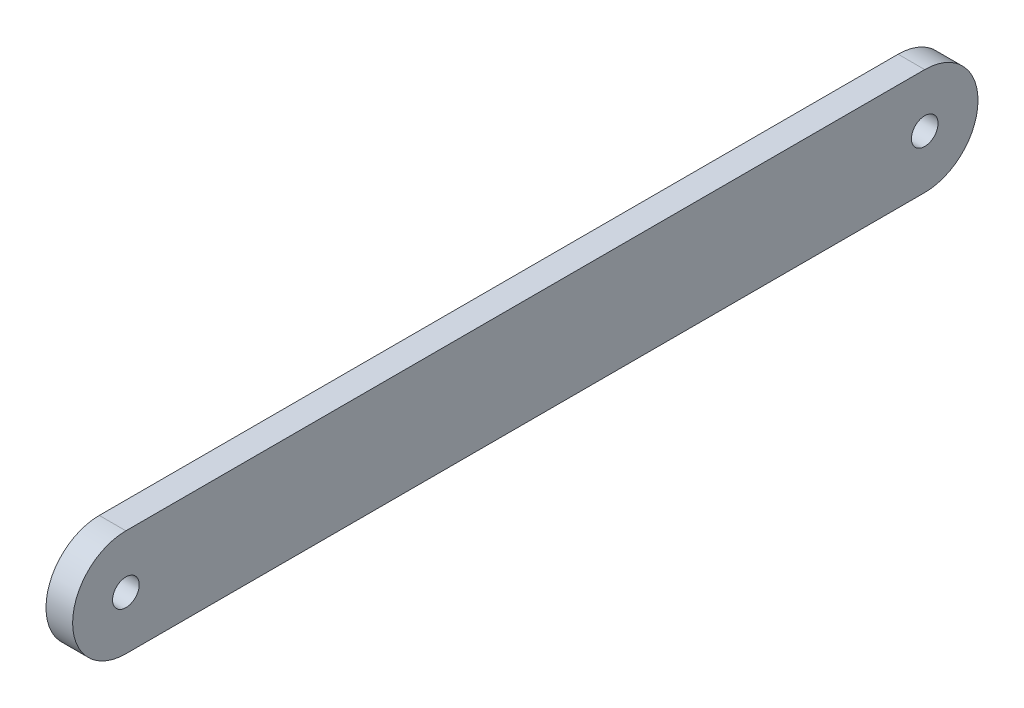
ISO-10303-21;
HEADER;
FILE_DESCRIPTION(('STEP AP214'),'2;1');
FILE_NAME('part.step','',(''),(''),'','','');
FILE_SCHEMA(('AUTOMOTIVE_DESIGN { 1 0 10303 214 1 1 1 1 }'));
ENDSEC;
DATA;
#1=APPLICATION_CONTEXT('core data for automotive mechanical design processes');
#2=APPLICATION_PROTOCOL_DEFINITION('international standard','automotive_design',2000,#1);
#3=PRODUCT_CONTEXT('',#1,'mechanical');
#4=PRODUCT('Part','Part','',(#3));
#5=PRODUCT_RELATED_PRODUCT_CATEGORY('part','',(#4));
#6=PRODUCT_DEFINITION_FORMATION('','',#4);
#7=PRODUCT_DEFINITION_CONTEXT('part definition',#1,'design');
#8=PRODUCT_DEFINITION('design','',#6,#7);
#9=PRODUCT_DEFINITION_SHAPE('','',#8);
#10=(LENGTH_UNIT() NAMED_UNIT(*) SI_UNIT(.MILLI.,.METRE.));
#11=(NAMED_UNIT(*) PLANE_ANGLE_UNIT() SI_UNIT($,.RADIAN.));
#12=(NAMED_UNIT(*) SI_UNIT($,.STERADIAN.) SOLID_ANGLE_UNIT());
#13=UNCERTAINTY_MEASURE_WITH_UNIT(LENGTH_MEASURE(1.E-05),#10,'distance_accuracy_value','');
#14=(GEOMETRIC_REPRESENTATION_CONTEXT(3) GLOBAL_UNCERTAINTY_ASSIGNED_CONTEXT((#13)) GLOBAL_UNIT_ASSIGNED_CONTEXT((#10,
#11,#12)) REPRESENTATION_CONTEXT('',''));
#15=CARTESIAN_POINT('',(0.,0.,0.));
#16=DIRECTION('',(0.,0.,1.));
#17=DIRECTION('',(1.,0.,0.));
#18=AXIS2_PLACEMENT_3D('',#15,#16,#17);
#19=CARTESIAN_POINT('',(5.,0.,0.));
#20=DIRECTION('',(1.,0.,0.));
#21=DIRECTION('',(0.,0.,-1.));
#22=AXIS2_PLACEMENT_3D('',#19,#20,#21);
#23=PLANE('',#22);
#24=CARTESIAN_POINT('',(5.,0.,0.));
#25=DIRECTION('',(1.,0.,0.));
#26=DIRECTION('',(0.,0.,-1.));
#27=AXIS2_PLACEMENT_3D('',#24,#25,#26);
#28=CIRCLE('',#27,2.5);
#29=CARTESIAN_POINT('',(5.,0.,-2.5));
#30=VERTEX_POINT('',#29);
#31=EDGE_CURVE('E112',#30,#30,#28,.T.);
#32=ORIENTED_EDGE('',*,*,#31,.F.);
#33=EDGE_LOOP('',(#32));
#34=FACE_BOUND('',#33,.T.);
#35=CARTESIAN_POINT('',(5.,0.,0.));
#36=DIRECTION('',(1.,0.,0.));
#37=DIRECTION('',(0.,0.,-1.));
#38=AXIS2_PLACEMENT_3D('',#35,#36,#37);
#39=CIRCLE('',#38,10.);
#40=CARTESIAN_POINT('',(5.,10.,0.));
#41=VERTEX_POINT('',#40);
#42=CARTESIAN_POINT('',(5.,-10.,0.));
#43=VERTEX_POINT('',#42);
#44=EDGE_CURVE('E92',#41,#43,#39,.T.);
#45=ORIENTED_EDGE('',*,*,#44,.T.);
#46=DIRECTION('',(0.,0.,-1.));
#47=VECTOR('',#46,1.);
#48=CARTESIAN_POINT('',(5.,-10.,0.));
#49=LINE('',#48,#47);
#50=CARTESIAN_POINT('',(5.,-9.99999999999998,-150.));
#51=VERTEX_POINT('',#50);
#52=EDGE_CURVE('E87',#43,#51,#49,.T.);
#53=ORIENTED_EDGE('',*,*,#52,.T.);
#54=CARTESIAN_POINT('',(5.,0.,-150.));
#55=DIRECTION('',(1.,0.,0.));
#56=DIRECTION('',(0.,0.,-1.));
#57=AXIS2_PLACEMENT_3D('',#54,#55,#56);
#58=CIRCLE('',#57,9.99999999999998);
#59=CARTESIAN_POINT('',(5.,9.99999999999998,-150.));
#60=VERTEX_POINT('',#59);
#61=EDGE_CURVE('E90',#51,#60,#58,.T.);
#62=ORIENTED_EDGE('',*,*,#61,.T.);
#63=DIRECTION('',(0.,0.,1.));
#64=VECTOR('',#63,1.);
#65=CARTESIAN_POINT('',(5.,10.,0.));
#66=LINE('',#65,#64);
#67=EDGE_CURVE('E57',#60,#41,#66,.T.);
#68=ORIENTED_EDGE('',*,*,#67,.T.);
#69=EDGE_LOOP('',(#45,#53,#62,#68));
#70=FACE_BOUND('',#69,.T.);
#71=CARTESIAN_POINT('',(5.,0.,-150.));
#72=DIRECTION('',(1.,0.,0.));
#73=DIRECTION('',(0.,0.,-1.));
#74=AXIS2_PLACEMENT_3D('',#71,#72,#73);
#75=CIRCLE('',#74,2.5);
#76=CARTESIAN_POINT('',(5.,0.,-152.5));
#77=VERTEX_POINT('',#76);
#78=EDGE_CURVE('E134',#77,#77,#75,.T.);
#79=ORIENTED_EDGE('',*,*,#78,.F.);
#80=EDGE_LOOP('',(#79));
#81=FACE_BOUND('',#80,.T.);
#82=ADVANCED_FACE('F39',(#34,#70,#81),#23,.T.);
#83=CARTESIAN_POINT('',(0.,0.,0.));
#84=DIRECTION('',(1.,0.,0.));
#85=DIRECTION('',(0.,0.,-1.));
#86=AXIS2_PLACEMENT_3D('',#83,#84,#85);
#87=PLANE('',#86);
#88=CARTESIAN_POINT('',(0.,0.,0.));
#89=DIRECTION('',(1.,0.,0.));
#90=DIRECTION('',(0.,0.,-1.));
#91=AXIS2_PLACEMENT_3D('',#88,#89,#90);
#92=CIRCLE('',#91,10.);
#93=CARTESIAN_POINT('',(0.,10.,0.));
#94=VERTEX_POINT('',#93);
#95=CARTESIAN_POINT('',(0.,-10.,0.));
#96=VERTEX_POINT('',#95);
#97=EDGE_CURVE('E108',#94,#96,#92,.T.);
#98=ORIENTED_EDGE('',*,*,#97,.F.);
#99=DIRECTION('',(0.,0.,1.));
#100=VECTOR('',#99,1.);
#101=CARTESIAN_POINT('',(0.,10.,0.));
#102=LINE('',#101,#100);
#103=CARTESIAN_POINT('',(0.,9.99999999999998,-150.));
#104=VERTEX_POINT('',#103);
#105=EDGE_CURVE('E80',#104,#94,#102,.T.);
#106=ORIENTED_EDGE('',*,*,#105,.F.);
#107=CARTESIAN_POINT('',(0.,0.,-150.));
#108=DIRECTION('',(1.,0.,0.));
#109=DIRECTION('',(0.,0.,-1.));
#110=AXIS2_PLACEMENT_3D('',#107,#108,#109);
#111=CIRCLE('',#110,9.99999999999998);
#112=CARTESIAN_POINT('',(0.,-9.99999999999998,-150.));
#113=VERTEX_POINT('',#112);
#114=EDGE_CURVE('E74',#113,#104,#111,.T.);
#115=ORIENTED_EDGE('',*,*,#114,.F.);
#116=DIRECTION('',(0.,0.,-1.));
#117=VECTOR('',#116,1.);
#118=CARTESIAN_POINT('',(0.,-10.,0.));
#119=LINE('',#118,#117);
#120=EDGE_CURVE('E97',#96,#113,#119,.T.);
#121=ORIENTED_EDGE('',*,*,#120,.F.);
#122=EDGE_LOOP('',(#98,#106,#115,#121));
#123=FACE_BOUND('',#122,.T.);
#124=CARTESIAN_POINT('',(0.,0.,0.));
#125=DIRECTION('',(1.,0.,0.));
#126=DIRECTION('',(0.,0.,-1.));
#127=AXIS2_PLACEMENT_3D('',#124,#125,#126);
#128=CIRCLE('',#127,2.5);
#129=CARTESIAN_POINT('',(0.,0.,-2.5));
#130=VERTEX_POINT('',#129);
#131=EDGE_CURVE('E130',#130,#130,#128,.T.);
#132=ORIENTED_EDGE('',*,*,#131,.T.);
#133=EDGE_LOOP('',(#132));
#134=FACE_BOUND('',#133,.T.);
#135=CARTESIAN_POINT('',(0.,0.,-150.));
#136=DIRECTION('',(1.,0.,0.));
#137=DIRECTION('',(0.,0.,-1.));
#138=AXIS2_PLACEMENT_3D('',#135,#136,#137);
#139=CIRCLE('',#138,2.5);
#140=CARTESIAN_POINT('',(0.,0.,-152.5));
#141=VERTEX_POINT('',#140);
#142=EDGE_CURVE('E138',#141,#141,#139,.T.);
#143=ORIENTED_EDGE('',*,*,#142,.T.);
#144=EDGE_LOOP('',(#143));
#145=FACE_BOUND('',#144,.T.);
#146=ADVANCED_FACE('F125',(#123,#134,#145),#87,.F.);
#147=CARTESIAN_POINT('',(5.,0.,0.));
#148=DIRECTION('',(-1.,0.,0.));
#149=DIRECTION('',(0.,0.,1.));
#150=AXIS2_PLACEMENT_3D('',#147,#148,#149);
#151=CYLINDRICAL_SURFACE('',#150,10.);
#152=ORIENTED_EDGE('',*,*,#97,.T.);
#153=DIRECTION('',(-1.,0.,0.));
#154=VECTOR('',#153,1.);
#155=CARTESIAN_POINT('',(5.,-10.,0.));
#156=LINE('',#155,#154);
#157=EDGE_CURVE('E11',#43,#96,#156,.T.);
#158=ORIENTED_EDGE('',*,*,#157,.F.);
#159=ORIENTED_EDGE('',*,*,#44,.F.);
#160=DIRECTION('',(-1.,0.,0.));
#161=VECTOR('',#160,1.);
#162=CARTESIAN_POINT('',(5.,10.,0.));
#163=LINE('',#162,#161);
#164=EDGE_CURVE('E104',#41,#94,#163,.T.);
#165=ORIENTED_EDGE('',*,*,#164,.T.);
#166=EDGE_LOOP('',(#152,#158,#159,#165));
#167=FACE_BOUND('',#166,.T.);
#168=ADVANCED_FACE('F41',(#167),#151,.T.);
#169=CARTESIAN_POINT('',(5.,-10.,0.));
#170=DIRECTION('',(0.,1.,0.));
#171=DIRECTION('',(0.,0.,1.));
#172=AXIS2_PLACEMENT_3D('',#169,#170,#171);
#173=PLANE('',#172);
#174=ORIENTED_EDGE('',*,*,#120,.T.);
#175=DIRECTION('',(-1.,0.,0.));
#176=VECTOR('',#175,1.);
#177=CARTESIAN_POINT('',(5.,-9.99999999999998,-150.));
#178=LINE('',#177,#176);
#179=EDGE_CURVE('E49',#51,#113,#178,.T.);
#180=ORIENTED_EDGE('',*,*,#179,.F.);
#181=ORIENTED_EDGE('',*,*,#52,.F.);
#182=ORIENTED_EDGE('',*,*,#157,.T.);
#183=EDGE_LOOP('',(#174,#180,#181,#182));
#184=FACE_BOUND('',#183,.T.);
#185=ADVANCED_FACE('F96',(#184),#173,.F.);
#186=CARTESIAN_POINT('',(5.,0.,-150.));
#187=DIRECTION('',(-1.,0.,0.));
#188=DIRECTION('',(0.,0.,1.));
#189=AXIS2_PLACEMENT_3D('',#186,#187,#188);
#190=CYLINDRICAL_SURFACE('',#189,9.99999999999998);
#191=ORIENTED_EDGE('',*,*,#114,.T.);
#192=DIRECTION('',(-1.,0.,0.));
#193=VECTOR('',#192,1.);
#194=CARTESIAN_POINT('',(5.,9.99999999999998,-150.));
#195=LINE('',#194,#193);
#196=EDGE_CURVE('E99',#60,#104,#195,.T.);
#197=ORIENTED_EDGE('',*,*,#196,.F.);
#198=ORIENTED_EDGE('',*,*,#61,.F.);
#199=ORIENTED_EDGE('',*,*,#179,.T.);
#200=EDGE_LOOP('',(#191,#197,#198,#199));
#201=FACE_BOUND('',#200,.T.);
#202=ADVANCED_FACE('F100',(#201),#190,.T.);
#203=CARTESIAN_POINT('',(5.,10.,0.));
#204=DIRECTION('',(0.,-1.,0.));
#205=DIRECTION('',(0.,0.,-1.));
#206=AXIS2_PLACEMENT_3D('',#203,#204,#205);
#207=PLANE('',#206);
#208=ORIENTED_EDGE('',*,*,#105,.T.);
#209=ORIENTED_EDGE('',*,*,#164,.F.);
#210=ORIENTED_EDGE('',*,*,#67,.F.);
#211=ORIENTED_EDGE('',*,*,#196,.T.);
#212=EDGE_LOOP('',(#208,#209,#210,#211));
#213=FACE_BOUND('',#212,.T.);
#214=ADVANCED_FACE('F122',(#213),#207,.F.);
#215=CARTESIAN_POINT('',(5.,0.,0.));
#216=DIRECTION('',(-1.,0.,0.));
#217=DIRECTION('',(0.,0.,1.));
#218=AXIS2_PLACEMENT_3D('',#215,#216,#217);
#219=CYLINDRICAL_SURFACE('',#218,2.5);
#220=ORIENTED_EDGE('',*,*,#31,.T.);
#221=EDGE_LOOP('',(#220));
#222=FACE_BOUND('',#221,.T.);
#223=ORIENTED_EDGE('',*,*,#131,.F.);
#224=EDGE_LOOP('',(#223));
#225=FACE_BOUND('',#224,.T.);
#226=ADVANCED_FACE('F157',(#222,#225),#219,.F.);
#227=CARTESIAN_POINT('',(5.,0.,-150.));
#228=DIRECTION('',(-1.,0.,0.));
#229=DIRECTION('',(0.,0.,1.));
#230=AXIS2_PLACEMENT_3D('',#227,#228,#229);
#231=CYLINDRICAL_SURFACE('',#230,2.5);
#232=ORIENTED_EDGE('',*,*,#78,.T.);
#233=EDGE_LOOP('',(#232));
#234=FACE_BOUND('',#233,.T.);
#235=ORIENTED_EDGE('',*,*,#142,.F.);
#236=EDGE_LOOP('',(#235));
#237=FACE_BOUND('',#236,.T.);
#238=ADVANCED_FACE('F146',(#234,#237),#231,.F.);
#239=CLOSED_SHELL('',(#82,#146,#168,#185,#202,#214,#226,#238));
#240=MANIFOLD_SOLID_BREP('B2',#239);
#241=ADVANCED_BREP_SHAPE_REPRESENTATION('',(#18,#240),#14);
#242=SHAPE_DEFINITION_REPRESENTATION(#9,#241);
ENDSEC;
END-ISO-10303-21;
